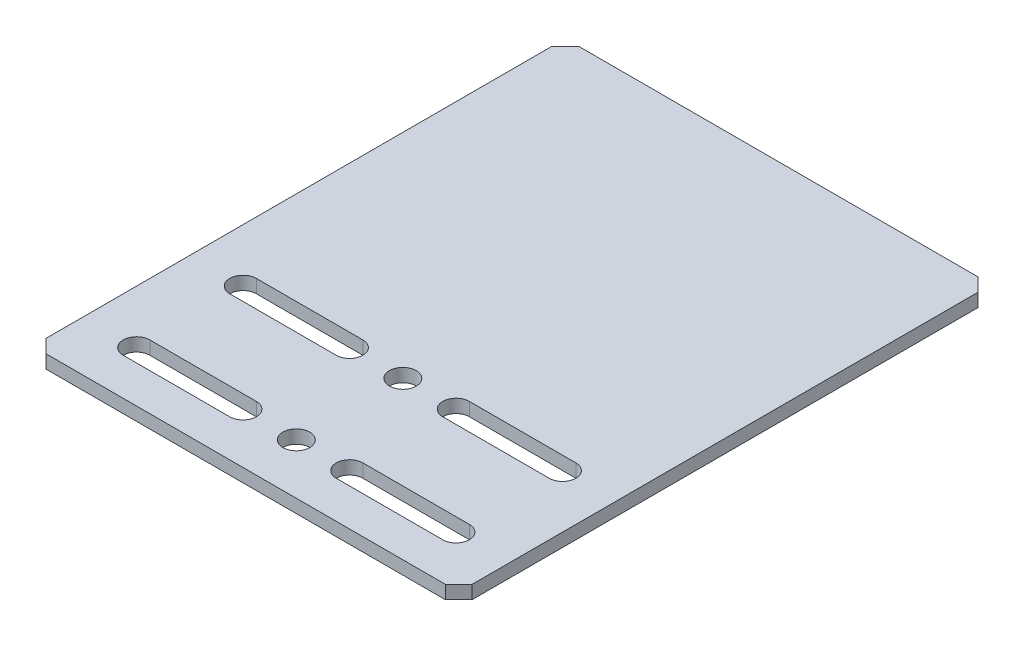
ISO-10303-21;
HEADER;
FILE_DESCRIPTION(('STEP AP214'),'2;1');
FILE_NAME('part.step','',(''),(''),'','','');
FILE_SCHEMA(('AUTOMOTIVE_DESIGN { 1 0 10303 214 1 1 1 1 }'));
ENDSEC;
DATA;
#1=APPLICATION_CONTEXT('core data for automotive mechanical design processes');
#2=APPLICATION_PROTOCOL_DEFINITION('international standard','automotive_design',2000,#1);
#3=PRODUCT_CONTEXT('',#1,'mechanical');
#4=PRODUCT('Part','Part','',(#3));
#5=PRODUCT_RELATED_PRODUCT_CATEGORY('part','',(#4));
#6=PRODUCT_DEFINITION_FORMATION('','',#4);
#7=PRODUCT_DEFINITION_CONTEXT('part definition',#1,'design');
#8=PRODUCT_DEFINITION('design','',#6,#7);
#9=PRODUCT_DEFINITION_SHAPE('','',#8);
#10=(LENGTH_UNIT() NAMED_UNIT(*) SI_UNIT(.MILLI.,.METRE.));
#11=(NAMED_UNIT(*) PLANE_ANGLE_UNIT() SI_UNIT($,.RADIAN.));
#12=(NAMED_UNIT(*) SI_UNIT($,.STERADIAN.) SOLID_ANGLE_UNIT());
#13=UNCERTAINTY_MEASURE_WITH_UNIT(LENGTH_MEASURE(1.E-05),#10,'distance_accuracy_value','');
#14=(GEOMETRIC_REPRESENTATION_CONTEXT(3) GLOBAL_UNCERTAINTY_ASSIGNED_CONTEXT((#13)) GLOBAL_UNIT_ASSIGNED_CONTEXT((#10,
#11,#12)) REPRESENTATION_CONTEXT('',''));
#15=CARTESIAN_POINT('',(0.,0.,0.));
#16=DIRECTION('',(0.,0.,1.));
#17=DIRECTION('',(1.,0.,0.));
#18=AXIS2_PLACEMENT_3D('',#15,#16,#17);
#19=CARTESIAN_POINT('',(0.,3.175,0.));
#20=DIRECTION('',(0.,1.,0.));
#21=DIRECTION('',(0.,0.,1.));
#22=AXIS2_PLACEMENT_3D('',#19,#20,#21);
#23=PLANE('',#22);
#24=DIRECTION('',(-1.,0.,0.));
#25=VECTOR('',#24,1.);
#26=CARTESIAN_POINT('',(0.,3.175,0.));
#27=LINE('',#26,#25);
#28=CARTESIAN_POINT('',(3.175,3.175,0.));
#29=VERTEX_POINT('',#28);
#30=CARTESIAN_POINT('',(98.425,3.175,0.));
#31=VERTEX_POINT('',#30);
#32=EDGE_CURVE('E326',#29,#31,#27,.F.);
#33=ORIENTED_EDGE('',*,*,#32,.T.);
#34=DIRECTION('',(-0.707106781186548,0.,0.707106781186548));
#35=VECTOR('',#34,1.);
#36=CARTESIAN_POINT('',(101.6,3.175,-3.17500000000001));
#37=LINE('',#36,#35);
#38=CARTESIAN_POINT('',(101.6,3.175,-3.17500000000004));
#39=VERTEX_POINT('',#38);
#40=EDGE_CURVE('E321',#31,#39,#37,.F.);
#41=ORIENTED_EDGE('',*,*,#40,.T.);
#42=DIRECTION('',(0.,0.,1.));
#43=VECTOR('',#42,1.);
#44=CARTESIAN_POINT('',(101.6,3.175,-127.));
#45=LINE('',#44,#43);
#46=CARTESIAN_POINT('',(101.6,3.175,-123.825));
#47=VERTEX_POINT('',#46);
#48=EDGE_CURVE('E316',#39,#47,#45,.F.);
#49=ORIENTED_EDGE('',*,*,#48,.T.);
#50=DIRECTION('',(0.707106781186544,0.,0.707106781186551));
#51=VECTOR('',#50,1.);
#52=CARTESIAN_POINT('',(98.425,3.175,-127.));
#53=LINE('',#52,#51);
#54=CARTESIAN_POINT('',(98.425,3.175,-127.));
#55=VERTEX_POINT('',#54);
#56=EDGE_CURVE('E311',#47,#55,#53,.F.);
#57=ORIENTED_EDGE('',*,*,#56,.T.);
#58=DIRECTION('',(1.,0.,0.));
#59=VECTOR('',#58,1.);
#60=CARTESIAN_POINT('',(0.,3.175,-127.));
#61=LINE('',#60,#59);
#62=CARTESIAN_POINT('',(3.17499999999998,3.175,-127.));
#63=VERTEX_POINT('',#62);
#64=EDGE_CURVE('E265',#55,#63,#61,.F.);
#65=ORIENTED_EDGE('',*,*,#64,.T.);
#66=DIRECTION('',(0.707106781186548,0.,-0.707106781186548));
#67=VECTOR('',#66,1.);
#68=CARTESIAN_POINT('',(0.,3.175,-123.825));
#69=LINE('',#68,#67);
#70=CARTESIAN_POINT('',(0.,3.175,-123.825));
#71=VERTEX_POINT('',#70);
#72=EDGE_CURVE('E341',#63,#71,#69,.F.);
#73=ORIENTED_EDGE('',*,*,#72,.T.);
#74=DIRECTION('',(0.,0.,-1.));
#75=VECTOR('',#74,1.);
#76=CARTESIAN_POINT('',(0.,3.175,-127.));
#77=LINE('',#76,#75);
#78=CARTESIAN_POINT('',(0.,3.175,-3.17500000000005));
#79=VERTEX_POINT('',#78);
#80=EDGE_CURVE('E336',#71,#79,#77,.F.);
#81=ORIENTED_EDGE('',*,*,#80,.T.);
#82=DIRECTION('',(-0.707106781186546,0.,-0.707106781186549));
#83=VECTOR('',#82,1.);
#84=CARTESIAN_POINT('',(3.175,3.175,0.));
#85=LINE('',#84,#83);
#86=EDGE_CURVE('E331',#79,#29,#85,.F.);
#87=ORIENTED_EDGE('',*,*,#86,.T.);
#88=EDGE_LOOP('',(#33,#41,#49,#57,#65,#73,#81,#87));
#89=FACE_BOUND('',#88,.T.);
#90=CARTESIAN_POINT('',(88.9,3.175,-12.065));
#91=DIRECTION('',(0.,-1.,0.));
#92=DIRECTION('',(0.,0.,-1.));
#93=AXIS2_PLACEMENT_3D('',#90,#91,#92);
#94=CIRCLE('',#93,3.175);
#95=CARTESIAN_POINT('',(88.9,3.175,-15.24));
#96=VERTEX_POINT('',#95);
#97=CARTESIAN_POINT('',(88.9,3.175,-8.89000000000003));
#98=VERTEX_POINT('',#97);
#99=EDGE_CURVE('E266',#96,#98,#94,.T.);
#100=ORIENTED_EDGE('',*,*,#99,.T.);
#101=DIRECTION('',(1.,0.,0.));
#102=VECTOR('',#101,1.);
#103=CARTESIAN_POINT('',(60.325,3.175,-8.89000000000001));
#104=LINE('',#103,#102);
#105=CARTESIAN_POINT('',(63.5,3.175,-8.89000000000002));
#106=VERTEX_POINT('',#105);
#107=EDGE_CURVE('E203',#98,#106,#104,.F.);
#108=ORIENTED_EDGE('',*,*,#107,.T.);
#109=CARTESIAN_POINT('',(63.5,3.175,-12.065));
#110=DIRECTION('',(0.,-1.,0.));
#111=DIRECTION('',(0.,0.,-1.));
#112=AXIS2_PLACEMENT_3D('',#109,#110,#111);
#113=CIRCLE('',#112,3.175);
#114=CARTESIAN_POINT('',(63.5,3.175,-15.24));
#115=VERTEX_POINT('',#114);
#116=EDGE_CURVE('E270',#106,#115,#113,.T.);
#117=ORIENTED_EDGE('',*,*,#116,.T.);
#118=DIRECTION('',(-1.,0.,0.));
#119=VECTOR('',#118,1.);
#120=CARTESIAN_POINT('',(60.325,3.175,-15.24));
#121=LINE('',#120,#119);
#122=EDGE_CURVE('E208',#115,#96,#121,.F.);
#123=ORIENTED_EDGE('',*,*,#122,.T.);
#124=EDGE_LOOP('',(#100,#108,#117,#123));
#125=FACE_BOUND('',#124,.T.);
#126=CARTESIAN_POINT('',(38.1,3.175,-12.065));
#127=DIRECTION('',(0.,-1.,0.));
#128=DIRECTION('',(0.,0.,-1.));
#129=AXIS2_PLACEMENT_3D('',#126,#127,#128);
#130=CIRCLE('',#129,3.175);
#131=CARTESIAN_POINT('',(38.1,3.175,-15.24));
#132=VERTEX_POINT('',#131);
#133=CARTESIAN_POINT('',(38.1,3.175,-8.89000000000001));
#134=VERTEX_POINT('',#133);
#135=EDGE_CURVE('E272',#132,#134,#130,.T.);
#136=ORIENTED_EDGE('',*,*,#135,.T.);
#137=DIRECTION('',(1.,0.,0.));
#138=VECTOR('',#137,1.);
#139=CARTESIAN_POINT('',(9.52499999999997,3.175,-8.89));
#140=LINE('',#139,#138);
#141=CARTESIAN_POINT('',(12.7,3.175,-8.89));
#142=VERTEX_POINT('',#141);
#143=EDGE_CURVE('E213',#134,#142,#140,.F.);
#144=ORIENTED_EDGE('',*,*,#143,.T.);
#145=CARTESIAN_POINT('',(12.7,3.175,-12.065));
#146=DIRECTION('',(0.,-1.,0.));
#147=DIRECTION('',(0.,0.,-1.));
#148=AXIS2_PLACEMENT_3D('',#145,#146,#147);
#149=CIRCLE('',#148,3.175);
#150=CARTESIAN_POINT('',(12.7,3.175,-15.24));
#151=VERTEX_POINT('',#150);
#152=EDGE_CURVE('E275',#142,#151,#149,.T.);
#153=ORIENTED_EDGE('',*,*,#152,.T.);
#154=DIRECTION('',(-1.,0.,0.));
#155=VECTOR('',#154,1.);
#156=CARTESIAN_POINT('',(9.52499999999996,3.175,-15.24));
#157=LINE('',#156,#155);
#158=EDGE_CURVE('E218',#151,#132,#157,.F.);
#159=ORIENTED_EDGE('',*,*,#158,.T.);
#160=EDGE_LOOP('',(#136,#144,#153,#159));
#161=FACE_BOUND('',#160,.T.);
#162=CARTESIAN_POINT('',(50.8,3.175,-12.065));
#163=DIRECTION('',(0.,1.,0.));
#164=DIRECTION('',(0.,0.,1.));
#165=AXIS2_PLACEMENT_3D('',#162,#163,#164);
#166=CIRCLE('',#165,3.2004);
#167=CARTESIAN_POINT('',(50.8,3.175,-8.86460000000001));
#168=VERTEX_POINT('',#167);
#169=EDGE_CURVE('E217',#168,#168,#166,.F.);
#170=ORIENTED_EDGE('',*,*,#169,.T.);
#171=EDGE_LOOP('',(#170));
#172=FACE_BOUND('',#171,.T.);
#173=DIRECTION('',(-1.,0.,0.));
#174=VECTOR('',#173,1.);
#175=CARTESIAN_POINT('',(9.52499999999996,3.175,-40.64));
#176=LINE('',#175,#174);
#177=CARTESIAN_POINT('',(12.7,3.175,-40.64));
#178=VERTEX_POINT('',#177);
#179=CARTESIAN_POINT('',(38.1,3.175,-40.64));
#180=VERTEX_POINT('',#179);
#181=EDGE_CURVE('E227',#178,#180,#176,.F.);
#182=ORIENTED_EDGE('',*,*,#181,.T.);
#183=CARTESIAN_POINT('',(38.1,3.175,-37.465));
#184=DIRECTION('',(0.,-1.,0.));
#185=DIRECTION('',(0.,0.,-1.));
#186=AXIS2_PLACEMENT_3D('',#183,#184,#185);
#187=CIRCLE('',#186,3.175);
#188=CARTESIAN_POINT('',(38.1,3.175,-34.29));
#189=VERTEX_POINT('',#188);
#190=EDGE_CURVE('E281',#180,#189,#187,.T.);
#191=ORIENTED_EDGE('',*,*,#190,.T.);
#192=DIRECTION('',(1.,0.,0.));
#193=VECTOR('',#192,1.);
#194=CARTESIAN_POINT('',(9.52499999999996,3.175,-34.29));
#195=LINE('',#194,#193);
#196=CARTESIAN_POINT('',(12.7,3.175,-34.29));
#197=VERTEX_POINT('',#196);
#198=EDGE_CURVE('E223',#189,#197,#195,.F.);
#199=ORIENTED_EDGE('',*,*,#198,.T.);
#200=CARTESIAN_POINT('',(12.7,3.175,-37.465));
#201=DIRECTION('',(0.,-1.,0.));
#202=DIRECTION('',(0.,0.,-1.));
#203=AXIS2_PLACEMENT_3D('',#200,#201,#202);
#204=CIRCLE('',#203,3.175);
#205=EDGE_CURVE('E279',#197,#178,#204,.T.);
#206=ORIENTED_EDGE('',*,*,#205,.T.);
#207=EDGE_LOOP('',(#182,#191,#199,#206));
#208=FACE_BOUND('',#207,.T.);
#209=CARTESIAN_POINT('',(50.8,3.175,-37.465));
#210=DIRECTION('',(0.,1.,0.));
#211=DIRECTION('',(0.,0.,1.));
#212=AXIS2_PLACEMENT_3D('',#209,#210,#211);
#213=CIRCLE('',#212,3.2004);
#214=CARTESIAN_POINT('',(50.8,3.175,-34.2646));
#215=VERTEX_POINT('',#214);
#216=EDGE_CURVE('E187',#215,#215,#213,.F.);
#217=ORIENTED_EDGE('',*,*,#216,.T.);
#218=EDGE_LOOP('',(#217));
#219=FACE_BOUND('',#218,.T.);
#220=DIRECTION('',(-1.,0.,0.));
#221=VECTOR('',#220,1.);
#222=CARTESIAN_POINT('',(60.325,3.175,-40.64));
#223=LINE('',#222,#221);
#224=CARTESIAN_POINT('',(63.5,3.175,-40.64));
#225=VERTEX_POINT('',#224);
#226=CARTESIAN_POINT('',(88.9,3.175,-40.64));
#227=VERTEX_POINT('',#226);
#228=EDGE_CURVE('E179',#225,#227,#223,.F.);
#229=ORIENTED_EDGE('',*,*,#228,.T.);
#230=CARTESIAN_POINT('',(88.9,3.175,-37.465));
#231=DIRECTION('',(0.,-1.,0.));
#232=DIRECTION('',(0.,0.,-1.));
#233=AXIS2_PLACEMENT_3D('',#230,#231,#232);
#234=CIRCLE('',#233,3.175);
#235=CARTESIAN_POINT('',(88.9,3.175,-34.29));
#236=VERTEX_POINT('',#235);
#237=EDGE_CURVE('E19',#227,#236,#234,.T.);
#238=ORIENTED_EDGE('',*,*,#237,.T.);
#239=DIRECTION('',(1.,0.,0.));
#240=VECTOR('',#239,1.);
#241=CARTESIAN_POINT('',(60.325,3.175,-34.29));
#242=LINE('',#241,#240);
#243=CARTESIAN_POINT('',(63.5,3.175,-34.29));
#244=VERTEX_POINT('',#243);
#245=EDGE_CURVE('E182',#236,#244,#242,.F.);
#246=ORIENTED_EDGE('',*,*,#245,.T.);
#247=CARTESIAN_POINT('',(63.5,3.175,-37.465));
#248=DIRECTION('',(0.,-1.,0.));
#249=DIRECTION('',(0.,0.,-1.));
#250=AXIS2_PLACEMENT_3D('',#247,#248,#249);
#251=CIRCLE('',#250,3.175);
#252=EDGE_CURVE('E177',#244,#225,#251,.T.);
#253=ORIENTED_EDGE('',*,*,#252,.T.);
#254=EDGE_LOOP('',(#229,#238,#246,#253));
#255=FACE_BOUND('',#254,.T.);
#256=ADVANCED_FACE('F16',(#89,#125,#161,#172,#208,#219,#255),#23,.T.);
#257=CARTESIAN_POINT('',(60.325,0.,-40.64));
#258=DIRECTION('',(0.,0.,-1.));
#259=DIRECTION('',(-1.,0.,0.));
#260=AXIS2_PLACEMENT_3D('',#257,#258,#259);
#261=PLANE('',#260);
#262=DIRECTION('',(0.,1.,0.));
#263=VECTOR('',#262,1.);
#264=CARTESIAN_POINT('',(63.5,0.,-40.64));
#265=LINE('',#264,#263);
#266=CARTESIAN_POINT('',(63.5,0.,-40.64));
#267=VERTEX_POINT('',#266);
#268=EDGE_CURVE('E192',#267,#225,#265,.T.);
#269=ORIENTED_EDGE('',*,*,#268,.F.);
#270=DIRECTION('',(1.,0.,0.));
#271=VECTOR('',#270,1.);
#272=CARTESIAN_POINT('',(0.,0.,-40.64));
#273=LINE('',#272,#271);
#274=CARTESIAN_POINT('',(88.9,0.,-40.64));
#275=VERTEX_POINT('',#274);
#276=EDGE_CURVE('E263',#267,#275,#273,.T.);
#277=ORIENTED_EDGE('',*,*,#276,.T.);
#278=DIRECTION('',(0.,-1.,0.));
#279=VECTOR('',#278,1.);
#280=CARTESIAN_POINT('',(88.9,0.,-40.64));
#281=LINE('',#280,#279);
#282=EDGE_CURVE('E194',#275,#227,#281,.F.);
#283=ORIENTED_EDGE('',*,*,#282,.T.);
#284=ORIENTED_EDGE('',*,*,#228,.F.);
#285=EDGE_LOOP('',(#269,#277,#283,#284));
#286=FACE_BOUND('',#285,.T.);
#287=ADVANCED_FACE('F190',(#286),#261,.F.);
#288=CARTESIAN_POINT('',(88.9,0.,-37.465));
#289=DIRECTION('',(0.,-1.,0.));
#290=DIRECTION('',(0.,0.,-1.));
#291=AXIS2_PLACEMENT_3D('',#288,#289,#290);
#292=CYLINDRICAL_SURFACE('',#291,3.175);
#293=DIRECTION('',(0.,1.,0.));
#294=VECTOR('',#293,1.);
#295=CARTESIAN_POINT('',(88.9,0.,-34.29));
#296=LINE('',#295,#294);
#297=CARTESIAN_POINT('',(88.9,0.,-34.29));
#298=VERTEX_POINT('',#297);
#299=EDGE_CURVE('E232',#298,#236,#296,.T.);
#300=ORIENTED_EDGE('',*,*,#299,.T.);
#301=ORIENTED_EDGE('',*,*,#237,.F.);
#302=ORIENTED_EDGE('',*,*,#282,.F.);
#303=CARTESIAN_POINT('',(88.9,0.,-37.465));
#304=DIRECTION('',(0.,-1.,0.));
#305=DIRECTION('',(0.,0.,-1.));
#306=AXIS2_PLACEMENT_3D('',#303,#304,#305);
#307=CIRCLE('',#306,3.175);
#308=EDGE_CURVE('E261',#275,#298,#307,.T.);
#309=ORIENTED_EDGE('',*,*,#308,.T.);
#310=EDGE_LOOP('',(#300,#301,#302,#309));
#311=FACE_BOUND('',#310,.T.);
#312=ADVANCED_FACE('F510',(#311),#292,.F.);
#313=CARTESIAN_POINT('',(60.325,0.,-34.29));
#314=DIRECTION('',(0.,0.,1.));
#315=DIRECTION('',(1.,0.,0.));
#316=AXIS2_PLACEMENT_3D('',#313,#314,#315);
#317=PLANE('',#316);
#318=DIRECTION('',(0.,-1.,0.));
#319=VECTOR('',#318,1.);
#320=CARTESIAN_POINT('',(63.5,0.,-34.29));
#321=LINE('',#320,#319);
#322=CARTESIAN_POINT('',(63.5,0.,-34.29));
#323=VERTEX_POINT('',#322);
#324=EDGE_CURVE('E188',#323,#244,#321,.F.);
#325=ORIENTED_EDGE('',*,*,#324,.T.);
#326=ORIENTED_EDGE('',*,*,#245,.F.);
#327=ORIENTED_EDGE('',*,*,#299,.F.);
#328=DIRECTION('',(1.,0.,0.));
#329=VECTOR('',#328,1.);
#330=CARTESIAN_POINT('',(0.,0.,-34.29));
#331=LINE('',#330,#329);
#332=EDGE_CURVE('E260',#298,#323,#331,.F.);
#333=ORIENTED_EDGE('',*,*,#332,.T.);
#334=EDGE_LOOP('',(#325,#326,#327,#333));
#335=FACE_BOUND('',#334,.T.);
#336=ADVANCED_FACE('F295',(#335),#317,.F.);
#337=CARTESIAN_POINT('',(63.5,0.,-37.465));
#338=DIRECTION('',(0.,-1.,0.));
#339=DIRECTION('',(0.,0.,-1.));
#340=AXIS2_PLACEMENT_3D('',#337,#338,#339);
#341=CYLINDRICAL_SURFACE('',#340,3.175);
#342=ORIENTED_EDGE('',*,*,#324,.F.);
#343=CARTESIAN_POINT('',(63.5,0.,-37.465));
#344=DIRECTION('',(0.,-1.,0.));
#345=DIRECTION('',(0.,0.,-1.));
#346=AXIS2_PLACEMENT_3D('',#343,#344,#345);
#347=CIRCLE('',#346,3.175);
#348=EDGE_CURVE('E198',#323,#267,#347,.T.);
#349=ORIENTED_EDGE('',*,*,#348,.T.);
#350=ORIENTED_EDGE('',*,*,#268,.T.);
#351=ORIENTED_EDGE('',*,*,#252,.F.);
#352=EDGE_LOOP('',(#342,#349,#350,#351));
#353=FACE_BOUND('',#352,.T.);
#354=ADVANCED_FACE('F197',(#353),#341,.F.);
#355=CARTESIAN_POINT('',(50.8,0.,-37.465));
#356=DIRECTION('',(0.,1.,0.));
#357=DIRECTION('',(0.,0.,1.));
#358=AXIS2_PLACEMENT_3D('',#355,#356,#357);
#359=CYLINDRICAL_SURFACE('',#358,3.2004);
#360=CARTESIAN_POINT('',(50.8,0.,-37.465));
#361=DIRECTION('',(0.,1.,0.));
#362=DIRECTION('',(0.,0.,1.));
#363=AXIS2_PLACEMENT_3D('',#360,#361,#362);
#364=CIRCLE('',#363,3.2004);
#365=CARTESIAN_POINT('',(50.8,0.,-34.2646));
#366=VERTEX_POINT('',#365);
#367=EDGE_CURVE('E257',#366,#366,#364,.F.);
#368=ORIENTED_EDGE('',*,*,#367,.T.);
#369=EDGE_LOOP('',(#368));
#370=FACE_BOUND('',#369,.T.);
#371=ORIENTED_EDGE('',*,*,#216,.F.);
#372=EDGE_LOOP('',(#371));
#373=FACE_BOUND('',#372,.T.);
#374=ADVANCED_FACE('F501',(#370,#373),#359,.F.);
#375=CARTESIAN_POINT('',(9.52499999999996,0.,-40.64));
#376=DIRECTION('',(0.,0.,-1.));
#377=DIRECTION('',(-1.,0.,0.));
#378=AXIS2_PLACEMENT_3D('',#375,#376,#377);
#379=PLANE('',#378);
#380=DIRECTION('',(0.,-1.,0.));
#381=VECTOR('',#380,1.);
#382=CARTESIAN_POINT('',(38.1,0.,-40.64));
#383=LINE('',#382,#381);
#384=CARTESIAN_POINT('',(38.1,0.,-40.64));
#385=VERTEX_POINT('',#384);
#386=EDGE_CURVE('E230',#385,#180,#383,.F.);
#387=ORIENTED_EDGE('',*,*,#386,.T.);
#388=ORIENTED_EDGE('',*,*,#181,.F.);
#389=DIRECTION('',(0.,1.,0.));
#390=VECTOR('',#389,1.);
#391=CARTESIAN_POINT('',(12.7,0.,-40.64));
#392=LINE('',#391,#390);
#393=CARTESIAN_POINT('',(12.7,0.,-40.64));
#394=VERTEX_POINT('',#393);
#395=EDGE_CURVE('E231',#394,#178,#392,.T.);
#396=ORIENTED_EDGE('',*,*,#395,.F.);
#397=DIRECTION('',(1.,0.,0.));
#398=VECTOR('',#397,1.);
#399=CARTESIAN_POINT('',(0.,0.,-40.64));
#400=LINE('',#399,#398);
#401=EDGE_CURVE('E253',#394,#385,#400,.T.);
#402=ORIENTED_EDGE('',*,*,#401,.T.);
#403=EDGE_LOOP('',(#387,#388,#396,#402));
#404=FACE_BOUND('',#403,.T.);
#405=ADVANCED_FACE('F498',(#404),#379,.F.);
#406=CARTESIAN_POINT('',(38.1,0.,-37.465));
#407=DIRECTION('',(0.,-1.,0.));
#408=DIRECTION('',(0.,0.,-1.));
#409=AXIS2_PLACEMENT_3D('',#406,#407,#408);
#410=CYLINDRICAL_SURFACE('',#409,3.175);
#411=DIRECTION('',(0.,1.,0.));
#412=VECTOR('',#411,1.);
#413=CARTESIAN_POINT('',(38.1,0.,-34.29));
#414=LINE('',#413,#412);
#415=CARTESIAN_POINT('',(38.1,0.,-34.29));
#416=VERTEX_POINT('',#415);
#417=EDGE_CURVE('E226',#416,#189,#414,.T.);
#418=ORIENTED_EDGE('',*,*,#417,.T.);
#419=ORIENTED_EDGE('',*,*,#190,.F.);
#420=ORIENTED_EDGE('',*,*,#386,.F.);
#421=CARTESIAN_POINT('',(38.1,0.,-37.465));
#422=DIRECTION('',(0.,-1.,0.));
#423=DIRECTION('',(0.,0.,-1.));
#424=AXIS2_PLACEMENT_3D('',#421,#422,#423);
#425=CIRCLE('',#424,3.175);
#426=EDGE_CURVE('E251',#385,#416,#425,.T.);
#427=ORIENTED_EDGE('',*,*,#426,.T.);
#428=EDGE_LOOP('',(#418,#419,#420,#427));
#429=FACE_BOUND('',#428,.T.);
#430=ADVANCED_FACE('F363',(#429),#410,.F.);
#431=CARTESIAN_POINT('',(9.52499999999996,0.,-34.29));
#432=DIRECTION('',(0.,0.,1.));
#433=DIRECTION('',(1.,0.,0.));
#434=AXIS2_PLACEMENT_3D('',#431,#432,#433);
#435=PLANE('',#434);
#436=ORIENTED_EDGE('',*,*,#417,.F.);
#437=DIRECTION('',(1.,0.,0.));
#438=VECTOR('',#437,1.);
#439=CARTESIAN_POINT('',(0.,0.,-34.29));
#440=LINE('',#439,#438);
#441=CARTESIAN_POINT('',(12.7,0.,-34.29));
#442=VERTEX_POINT('',#441);
#443=EDGE_CURVE('E250',#416,#442,#440,.F.);
#444=ORIENTED_EDGE('',*,*,#443,.T.);
#445=DIRECTION('',(0.,-1.,0.));
#446=VECTOR('',#445,1.);
#447=CARTESIAN_POINT('',(12.7,0.,-34.29));
#448=LINE('',#447,#446);
#449=EDGE_CURVE('E225',#442,#197,#448,.F.);
#450=ORIENTED_EDGE('',*,*,#449,.T.);
#451=ORIENTED_EDGE('',*,*,#198,.F.);
#452=EDGE_LOOP('',(#436,#444,#450,#451));
#453=FACE_BOUND('',#452,.T.);
#454=ADVANCED_FACE('F369',(#453),#435,.F.);
#455=CARTESIAN_POINT('',(12.7,0.,-37.465));
#456=DIRECTION('',(0.,-1.,0.));
#457=DIRECTION('',(0.,0.,-1.));
#458=AXIS2_PLACEMENT_3D('',#455,#456,#457);
#459=CYLINDRICAL_SURFACE('',#458,3.175);
#460=ORIENTED_EDGE('',*,*,#449,.F.);
#461=CARTESIAN_POINT('',(12.7,0.,-37.465));
#462=DIRECTION('',(0.,-1.,0.));
#463=DIRECTION('',(0.,0.,-1.));
#464=AXIS2_PLACEMENT_3D('',#461,#462,#463);
#465=CIRCLE('',#464,3.175);
#466=EDGE_CURVE('E254',#442,#394,#465,.T.);
#467=ORIENTED_EDGE('',*,*,#466,.T.);
#468=ORIENTED_EDGE('',*,*,#395,.T.);
#469=ORIENTED_EDGE('',*,*,#205,.F.);
#470=EDGE_LOOP('',(#460,#467,#468,#469));
#471=FACE_BOUND('',#470,.T.);
#472=ADVANCED_FACE('F490',(#471),#459,.F.);
#473=CARTESIAN_POINT('',(50.8,0.,-12.065));
#474=DIRECTION('',(0.,1.,0.));
#475=DIRECTION('',(0.,0.,1.));
#476=AXIS2_PLACEMENT_3D('',#473,#474,#475);
#477=CYLINDRICAL_SURFACE('',#476,3.2004);
#478=CARTESIAN_POINT('',(50.8,0.,-12.065));
#479=DIRECTION('',(0.,1.,0.));
#480=DIRECTION('',(0.,0.,1.));
#481=AXIS2_PLACEMENT_3D('',#478,#479,#480);
#482=CIRCLE('',#481,3.2004);
#483=CARTESIAN_POINT('',(50.8,0.,-8.86460000000001));
#484=VERTEX_POINT('',#483);
#485=EDGE_CURVE('E247',#484,#484,#482,.F.);
#486=ORIENTED_EDGE('',*,*,#485,.T.);
#487=EDGE_LOOP('',(#486));
#488=FACE_BOUND('',#487,.T.);
#489=ORIENTED_EDGE('',*,*,#169,.F.);
#490=EDGE_LOOP('',(#489));
#491=FACE_BOUND('',#490,.T.);
#492=ADVANCED_FACE('F486',(#488,#491),#477,.F.);
#493=CARTESIAN_POINT('',(9.52499999999997,0.,-8.89));
#494=DIRECTION('',(0.,0.,1.));
#495=DIRECTION('',(1.,0.,0.));
#496=AXIS2_PLACEMENT_3D('',#493,#494,#495);
#497=PLANE('',#496);
#498=DIRECTION('',(0.,-1.,0.));
#499=VECTOR('',#498,1.);
#500=CARTESIAN_POINT('',(38.1,0.,-8.89000000000001));
#501=LINE('',#500,#499);
#502=CARTESIAN_POINT('',(38.1,0.,-8.89000000000001));
#503=VERTEX_POINT('',#502);
#504=EDGE_CURVE('E207',#134,#503,#501,.T.);
#505=ORIENTED_EDGE('',*,*,#504,.T.);
#506=DIRECTION('',(1.,0.,0.));
#507=VECTOR('',#506,1.);
#508=CARTESIAN_POINT('',(0.,0.,-8.89));
#509=LINE('',#508,#507);
#510=CARTESIAN_POINT('',(12.7,0.,-8.89));
#511=VERTEX_POINT('',#510);
#512=EDGE_CURVE('E246',#503,#511,#509,.F.);
#513=ORIENTED_EDGE('',*,*,#512,.T.);
#514=DIRECTION('',(0.,-1.,0.));
#515=VECTOR('',#514,1.);
#516=CARTESIAN_POINT('',(12.7,0.,-8.89));
#517=LINE('',#516,#515);
#518=EDGE_CURVE('E216',#511,#142,#517,.F.);
#519=ORIENTED_EDGE('',*,*,#518,.T.);
#520=ORIENTED_EDGE('',*,*,#143,.F.);
#521=EDGE_LOOP('',(#505,#513,#519,#520));
#522=FACE_BOUND('',#521,.T.);
#523=ADVANCED_FACE('F482',(#522),#497,.F.);
#524=CARTESIAN_POINT('',(12.7,0.,-12.065));
#525=DIRECTION('',(0.,-1.,0.));
#526=DIRECTION('',(0.,0.,-1.));
#527=AXIS2_PLACEMENT_3D('',#524,#525,#526);
#528=CYLINDRICAL_SURFACE('',#527,3.175);
#529=CARTESIAN_POINT('',(12.7,0.,-12.065));
#530=DIRECTION('',(0.,-1.,0.));
#531=DIRECTION('',(0.,0.,-1.));
#532=AXIS2_PLACEMENT_3D('',#529,#530,#531);
#533=CIRCLE('',#532,3.175);
#534=CARTESIAN_POINT('',(12.7,0.,-15.24));
#535=VERTEX_POINT('',#534);
#536=EDGE_CURVE('E244',#511,#535,#533,.T.);
#537=ORIENTED_EDGE('',*,*,#536,.T.);
#538=DIRECTION('',(0.,1.,0.));
#539=VECTOR('',#538,1.);
#540=CARTESIAN_POINT('',(12.7,0.,-15.24));
#541=LINE('',#540,#539);
#542=EDGE_CURVE('E222',#535,#151,#541,.T.);
#543=ORIENTED_EDGE('',*,*,#542,.T.);
#544=ORIENTED_EDGE('',*,*,#152,.F.);
#545=ORIENTED_EDGE('',*,*,#518,.F.);
#546=EDGE_LOOP('',(#537,#543,#544,#545));
#547=FACE_BOUND('',#546,.T.);
#548=ADVANCED_FACE('F478',(#547),#528,.F.);
#549=CARTESIAN_POINT('',(9.52499999999996,0.,-15.24));
#550=DIRECTION('',(0.,0.,-1.));
#551=DIRECTION('',(-1.,0.,0.));
#552=AXIS2_PLACEMENT_3D('',#549,#550,#551);
#553=PLANE('',#552);
#554=DIRECTION('',(0.,-1.,0.));
#555=VECTOR('',#554,1.);
#556=CARTESIAN_POINT('',(38.1,0.,-15.24));
#557=LINE('',#556,#555);
#558=CARTESIAN_POINT('',(38.1,0.,-15.24));
#559=VERTEX_POINT('',#558);
#560=EDGE_CURVE('E221',#559,#132,#557,.F.);
#561=ORIENTED_EDGE('',*,*,#560,.T.);
#562=ORIENTED_EDGE('',*,*,#158,.F.);
#563=ORIENTED_EDGE('',*,*,#542,.F.);
#564=DIRECTION('',(1.,0.,0.));
#565=VECTOR('',#564,1.);
#566=CARTESIAN_POINT('',(0.,0.,-15.24));
#567=LINE('',#566,#565);
#568=EDGE_CURVE('E243',#535,#559,#567,.T.);
#569=ORIENTED_EDGE('',*,*,#568,.T.);
#570=EDGE_LOOP('',(#561,#562,#563,#569));
#571=FACE_BOUND('',#570,.T.);
#572=ADVANCED_FACE('F474',(#571),#553,.F.);
#573=CARTESIAN_POINT('',(38.1,0.,-12.065));
#574=DIRECTION('',(0.,-1.,0.));
#575=DIRECTION('',(0.,0.,-1.));
#576=AXIS2_PLACEMENT_3D('',#573,#574,#575);
#577=CYLINDRICAL_SURFACE('',#576,3.175);
#578=ORIENTED_EDGE('',*,*,#504,.F.);
#579=ORIENTED_EDGE('',*,*,#135,.F.);
#580=ORIENTED_EDGE('',*,*,#560,.F.);
#581=CARTESIAN_POINT('',(38.1,0.,-12.065));
#582=DIRECTION('',(0.,-1.,0.));
#583=DIRECTION('',(0.,0.,-1.));
#584=AXIS2_PLACEMENT_3D('',#581,#582,#583);
#585=CIRCLE('',#584,3.175);
#586=EDGE_CURVE('E241',#559,#503,#585,.T.);
#587=ORIENTED_EDGE('',*,*,#586,.T.);
#588=EDGE_LOOP('',(#578,#579,#580,#587));
#589=FACE_BOUND('',#588,.T.);
#590=ADVANCED_FACE('F470',(#589),#577,.F.);
#591=CARTESIAN_POINT('',(60.325,0.,-8.89000000000001));
#592=DIRECTION('',(0.,0.,1.));
#593=DIRECTION('',(1.,0.,0.));
#594=AXIS2_PLACEMENT_3D('',#591,#592,#593);
#595=PLANE('',#594);
#596=DIRECTION('',(0.,-1.,0.));
#597=VECTOR('',#596,1.);
#598=CARTESIAN_POINT('',(63.5,0.,-8.89000000000002));
#599=LINE('',#598,#597);
#600=CARTESIAN_POINT('',(63.5,0.,-8.89000000000002));
#601=VERTEX_POINT('',#600);
#602=EDGE_CURVE('E206',#601,#106,#599,.F.);
#603=ORIENTED_EDGE('',*,*,#602,.T.);
#604=ORIENTED_EDGE('',*,*,#107,.F.);
#605=DIRECTION('',(0.,-1.,0.));
#606=VECTOR('',#605,1.);
#607=CARTESIAN_POINT('',(88.9,0.,-8.89000000000003));
#608=LINE('',#607,#606);
#609=CARTESIAN_POINT('',(88.9,0.,-8.89000000000003));
#610=VERTEX_POINT('',#609);
#611=EDGE_CURVE('E269',#98,#610,#608,.T.);
#612=ORIENTED_EDGE('',*,*,#611,.T.);
#613=DIRECTION('',(1.,0.,0.));
#614=VECTOR('',#613,1.);
#615=CARTESIAN_POINT('',(0.,0.,-8.89000000000003));
#616=LINE('',#615,#614);
#617=EDGE_CURVE('E240',#610,#601,#616,.F.);
#618=ORIENTED_EDGE('',*,*,#617,.T.);
#619=EDGE_LOOP('',(#603,#604,#612,#618));
#620=FACE_BOUND('',#619,.T.);
#621=ADVANCED_FACE('F466',(#620),#595,.F.);
#622=CARTESIAN_POINT('',(63.5,0.,-12.065));
#623=DIRECTION('',(0.,-1.,0.));
#624=DIRECTION('',(0.,0.,-1.));
#625=AXIS2_PLACEMENT_3D('',#622,#623,#624);
#626=CYLINDRICAL_SURFACE('',#625,3.175);
#627=CARTESIAN_POINT('',(63.5,0.,-12.065));
#628=DIRECTION('',(0.,-1.,0.));
#629=DIRECTION('',(0.,0.,-1.));
#630=AXIS2_PLACEMENT_3D('',#627,#628,#629);
#631=CIRCLE('',#630,3.175);
#632=CARTESIAN_POINT('',(63.5,0.,-15.24));
#633=VERTEX_POINT('',#632);
#634=EDGE_CURVE('E238',#601,#633,#631,.T.);
#635=ORIENTED_EDGE('',*,*,#634,.T.);
#636=DIRECTION('',(0.,1.,0.));
#637=VECTOR('',#636,1.);
#638=CARTESIAN_POINT('',(63.5,0.,-15.24));
#639=LINE('',#638,#637);
#640=EDGE_CURVE('E212',#633,#115,#639,.T.);
#641=ORIENTED_EDGE('',*,*,#640,.T.);
#642=ORIENTED_EDGE('',*,*,#116,.F.);
#643=ORIENTED_EDGE('',*,*,#602,.F.);
#644=EDGE_LOOP('',(#635,#641,#642,#643));
#645=FACE_BOUND('',#644,.T.);
#646=ADVANCED_FACE('F462',(#645),#626,.F.);
#647=CARTESIAN_POINT('',(60.325,0.,-15.24));
#648=DIRECTION('',(0.,0.,-1.));
#649=DIRECTION('',(-1.,0.,0.));
#650=AXIS2_PLACEMENT_3D('',#647,#648,#649);
#651=PLANE('',#650);
#652=ORIENTED_EDGE('',*,*,#640,.F.);
#653=DIRECTION('',(1.,0.,0.));
#654=VECTOR('',#653,1.);
#655=CARTESIAN_POINT('',(0.,0.,-15.24));
#656=LINE('',#655,#654);
#657=CARTESIAN_POINT('',(88.9,0.,-15.24));
#658=VERTEX_POINT('',#657);
#659=EDGE_CURVE('E237',#633,#658,#656,.T.);
#660=ORIENTED_EDGE('',*,*,#659,.T.);
#661=DIRECTION('',(0.,-1.,0.));
#662=VECTOR('',#661,1.);
#663=CARTESIAN_POINT('',(88.9,0.,-15.24));
#664=LINE('',#663,#662);
#665=EDGE_CURVE('E211',#658,#96,#664,.F.);
#666=ORIENTED_EDGE('',*,*,#665,.T.);
#667=ORIENTED_EDGE('',*,*,#122,.F.);
#668=EDGE_LOOP('',(#652,#660,#666,#667));
#669=FACE_BOUND('',#668,.T.);
#670=ADVANCED_FACE('F458',(#669),#651,.F.);
#671=CARTESIAN_POINT('',(88.9,0.,-12.065));
#672=DIRECTION('',(0.,-1.,0.));
#673=DIRECTION('',(0.,0.,-1.));
#674=AXIS2_PLACEMENT_3D('',#671,#672,#673);
#675=CYLINDRICAL_SURFACE('',#674,3.175);
#676=ORIENTED_EDGE('',*,*,#611,.F.);
#677=ORIENTED_EDGE('',*,*,#99,.F.);
#678=ORIENTED_EDGE('',*,*,#665,.F.);
#679=CARTESIAN_POINT('',(88.9,0.,-12.065));
#680=DIRECTION('',(0.,-1.,0.));
#681=DIRECTION('',(0.,0.,-1.));
#682=AXIS2_PLACEMENT_3D('',#679,#680,#681);
#683=CIRCLE('',#682,3.175);
#684=EDGE_CURVE('E234',#658,#610,#683,.T.);
#685=ORIENTED_EDGE('',*,*,#684,.T.);
#686=EDGE_LOOP('',(#676,#677,#678,#685));
#687=FACE_BOUND('',#686,.T.);
#688=ADVANCED_FACE('F455',(#687),#675,.F.);
#689=CARTESIAN_POINT('',(0.,3.175,-123.825));
#690=DIRECTION('',(0.707106781186548,0.,0.707106781186548));
#691=DIRECTION('',(0.707106781186548,0.,-0.707106781186548));
#692=AXIS2_PLACEMENT_3D('',#689,#690,#691);
#693=PLANE('',#692);
#694=DIRECTION('',(0.,1.,0.));
#695=VECTOR('',#694,1.);
#696=CARTESIAN_POINT('',(3.175,3.175,-127.));
#697=LINE('',#696,#695);
#698=CARTESIAN_POINT('',(3.17499999999998,0.,-127.));
#699=VERTEX_POINT('',#698);
#700=EDGE_CURVE('E308',#63,#699,#697,.F.);
#701=ORIENTED_EDGE('',*,*,#700,.T.);
#702=DIRECTION('',(-0.707106781186547,0.,0.707106781186548));
#703=VECTOR('',#702,1.);
#704=CARTESIAN_POINT('',(3.17499999999997,0.,-127.));
#705=LINE('',#704,#703);
#706=CARTESIAN_POINT('',(0.,0.,-123.825));
#707=VERTEX_POINT('',#706);
#708=EDGE_CURVE('E236',#699,#707,#705,.T.);
#709=ORIENTED_EDGE('',*,*,#708,.T.);
#710=DIRECTION('',(0.,1.,0.));
#711=VECTOR('',#710,1.);
#712=CARTESIAN_POINT('',(0.,3.175,-123.825));
#713=LINE('',#712,#711);
#714=EDGE_CURVE('E338',#707,#71,#713,.T.);
#715=ORIENTED_EDGE('',*,*,#714,.T.);
#716=ORIENTED_EDGE('',*,*,#72,.F.);
#717=EDGE_LOOP('',(#701,#709,#715,#716));
#718=FACE_BOUND('',#717,.T.);
#719=ADVANCED_FACE('F430',(#718),#693,.F.);
#720=CARTESIAN_POINT('',(0.,3.175,-127.));
#721=DIRECTION('',(1.,0.,0.));
#722=DIRECTION('',(0.,0.,-1.));
#723=AXIS2_PLACEMENT_3D('',#720,#721,#722);
#724=PLANE('',#723);
#725=ORIENTED_EDGE('',*,*,#714,.F.);
#726=DIRECTION('',(0.,0.,1.));
#727=VECTOR('',#726,1.);
#728=CARTESIAN_POINT('',(0.,0.,0.));
#729=LINE('',#728,#727);
#730=CARTESIAN_POINT('',(0.,0.,-3.17500000000004));
#731=VERTEX_POINT('',#730);
#732=EDGE_CURVE('E387',#707,#731,#729,.T.);
#733=ORIENTED_EDGE('',*,*,#732,.T.);
#734=DIRECTION('',(0.,1.,0.));
#735=VECTOR('',#734,1.);
#736=CARTESIAN_POINT('',(0.,3.175,-3.17500000000001));
#737=LINE('',#736,#735);
#738=EDGE_CURVE('E333',#731,#79,#737,.T.);
#739=ORIENTED_EDGE('',*,*,#738,.T.);
#740=ORIENTED_EDGE('',*,*,#80,.F.);
#741=EDGE_LOOP('',(#725,#733,#739,#740));
#742=FACE_BOUND('',#741,.T.);
#743=ADVANCED_FACE('F427',(#742),#724,.F.);
#744=CARTESIAN_POINT('',(3.175,3.175,0.));
#745=DIRECTION('',(0.707106781186549,0.,-0.707106781186546));
#746=DIRECTION('',(-0.707106781186546,0.,-0.707106781186549));
#747=AXIS2_PLACEMENT_3D('',#744,#745,#746);
#748=PLANE('',#747);
#749=ORIENTED_EDGE('',*,*,#738,.F.);
#750=DIRECTION('',(0.707106781186546,0.,0.707106781186549));
#751=VECTOR('',#750,1.);
#752=CARTESIAN_POINT('',(0.,0.,-3.17500000000001));
#753=LINE('',#752,#751);
#754=CARTESIAN_POINT('',(3.175,0.,0.));
#755=VERTEX_POINT('',#754);
#756=EDGE_CURVE('E390',#731,#755,#753,.T.);
#757=ORIENTED_EDGE('',*,*,#756,.T.);
#758=DIRECTION('',(0.,1.,0.));
#759=VECTOR('',#758,1.);
#760=CARTESIAN_POINT('',(3.175,3.175,0.));
#761=LINE('',#760,#759);
#762=EDGE_CURVE('E328',#755,#29,#761,.T.);
#763=ORIENTED_EDGE('',*,*,#762,.T.);
#764=ORIENTED_EDGE('',*,*,#86,.F.);
#765=EDGE_LOOP('',(#749,#757,#763,#764));
#766=FACE_BOUND('',#765,.T.);
#767=ADVANCED_FACE('F424',(#766),#748,.F.);
#768=CARTESIAN_POINT('',(0.,3.175,0.));
#769=DIRECTION('',(0.,0.,-1.));
#770=DIRECTION('',(-1.,0.,0.));
#771=AXIS2_PLACEMENT_3D('',#768,#769,#770);
#772=PLANE('',#771);
#773=ORIENTED_EDGE('',*,*,#762,.F.);
#774=DIRECTION('',(1.,0.,0.));
#775=VECTOR('',#774,1.);
#776=CARTESIAN_POINT('',(0.,0.,0.));
#777=LINE('',#776,#775);
#778=CARTESIAN_POINT('',(98.4249999999999,0.,0.));
#779=VERTEX_POINT('',#778);
#780=EDGE_CURVE('E393',#755,#779,#777,.T.);
#781=ORIENTED_EDGE('',*,*,#780,.T.);
#782=DIRECTION('',(0.,1.,0.));
#783=VECTOR('',#782,1.);
#784=CARTESIAN_POINT('',(98.4249999999999,3.175,0.));
#785=LINE('',#784,#783);
#786=EDGE_CURVE('E323',#779,#31,#785,.T.);
#787=ORIENTED_EDGE('',*,*,#786,.T.);
#788=ORIENTED_EDGE('',*,*,#32,.F.);
#789=EDGE_LOOP('',(#773,#781,#787,#788));
#790=FACE_BOUND('',#789,.T.);
#791=ADVANCED_FACE('F420',(#790),#772,.F.);
#792=CARTESIAN_POINT('',(101.6,3.175,-3.17500000000001));
#793=DIRECTION('',(-0.707106781186548,0.,-0.707106781186548));
#794=DIRECTION('',(-0.707106781186548,0.,0.707106781186548));
#795=AXIS2_PLACEMENT_3D('',#792,#793,#794);
#796=PLANE('',#795);
#797=ORIENTED_EDGE('',*,*,#786,.F.);
#798=DIRECTION('',(0.707106781186549,0.,-0.707106781186546));
#799=VECTOR('',#798,1.);
#800=CARTESIAN_POINT('',(98.4249999999999,0.,0.));
#801=LINE('',#800,#799);
#802=CARTESIAN_POINT('',(101.6,0.,-3.17500000000004));
#803=VERTEX_POINT('',#802);
#804=EDGE_CURVE('E396',#779,#803,#801,.T.);
#805=ORIENTED_EDGE('',*,*,#804,.T.);
#806=DIRECTION('',(0.,1.,0.));
#807=VECTOR('',#806,1.);
#808=CARTESIAN_POINT('',(101.6,3.175,-3.17500000000004));
#809=LINE('',#808,#807);
#810=EDGE_CURVE('E318',#803,#39,#809,.T.);
#811=ORIENTED_EDGE('',*,*,#810,.T.);
#812=ORIENTED_EDGE('',*,*,#40,.F.);
#813=EDGE_LOOP('',(#797,#805,#811,#812));
#814=FACE_BOUND('',#813,.T.);
#815=ADVANCED_FACE('F416',(#814),#796,.F.);
#816=CARTESIAN_POINT('',(101.6,3.175,-127.));
#817=DIRECTION('',(-1.,0.,0.));
#818=DIRECTION('',(0.,0.,1.));
#819=AXIS2_PLACEMENT_3D('',#816,#817,#818);
#820=PLANE('',#819);
#821=DIRECTION('',(0.,1.,0.));
#822=VECTOR('',#821,1.);
#823=CARTESIAN_POINT('',(101.6,3.175,-123.825));
#824=LINE('',#823,#822);
#825=CARTESIAN_POINT('',(101.6,0.,-123.825));
#826=VERTEX_POINT('',#825);
#827=EDGE_CURVE('E313',#826,#47,#824,.T.);
#828=ORIENTED_EDGE('',*,*,#827,.T.);
#829=ORIENTED_EDGE('',*,*,#48,.F.);
#830=ORIENTED_EDGE('',*,*,#810,.F.);
#831=DIRECTION('',(0.,0.,1.));
#832=VECTOR('',#831,1.);
#833=CARTESIAN_POINT('',(101.6,0.,0.));
#834=LINE('',#833,#832);
#835=EDGE_CURVE('E399',#803,#826,#834,.F.);
#836=ORIENTED_EDGE('',*,*,#835,.T.);
#837=EDGE_LOOP('',(#828,#829,#830,#836));
#838=FACE_BOUND('',#837,.T.);
#839=ADVANCED_FACE('F412',(#838),#820,.F.);
#840=CARTESIAN_POINT('',(98.425,3.175,-127.));
#841=DIRECTION('',(-0.707106781186551,0.,0.707106781186544));
#842=DIRECTION('',(0.707106781186544,0.,0.707106781186551));
#843=AXIS2_PLACEMENT_3D('',#840,#841,#842);
#844=PLANE('',#843);
#845=ORIENTED_EDGE('',*,*,#827,.F.);
#846=DIRECTION('',(-0.707106781186547,0.,-0.707106781186547));
#847=VECTOR('',#846,1.);
#848=CARTESIAN_POINT('',(101.6,0.,-123.825));
#849=LINE('',#848,#847);
#850=CARTESIAN_POINT('',(98.425,0.,-127.));
#851=VERTEX_POINT('',#850);
#852=EDGE_CURVE('E25',#826,#851,#849,.T.);
#853=ORIENTED_EDGE('',*,*,#852,.T.);
#854=DIRECTION('',(0.,1.,0.));
#855=VECTOR('',#854,1.);
#856=CARTESIAN_POINT('',(98.4249999999999,3.175,-127.));
#857=LINE('',#856,#855);
#858=EDGE_CURVE('E33',#851,#55,#857,.T.);
#859=ORIENTED_EDGE('',*,*,#858,.T.);
#860=ORIENTED_EDGE('',*,*,#56,.F.);
#861=EDGE_LOOP('',(#845,#853,#859,#860));
#862=FACE_BOUND('',#861,.T.);
#863=ADVANCED_FACE('F405',(#862),#844,.F.);
#864=CARTESIAN_POINT('',(0.,3.175,-127.));
#865=DIRECTION('',(0.,0.,1.));
#866=DIRECTION('',(1.,0.,0.));
#867=AXIS2_PLACEMENT_3D('',#864,#865,#866);
#868=PLANE('',#867);
#869=ORIENTED_EDGE('',*,*,#858,.F.);
#870=DIRECTION('',(1.,0.,0.));
#871=VECTOR('',#870,1.);
#872=CARTESIAN_POINT('',(0.,0.,-127.));
#873=LINE('',#872,#871);
#874=EDGE_CURVE('E10',#851,#699,#873,.F.);
#875=ORIENTED_EDGE('',*,*,#874,.T.);
#876=ORIENTED_EDGE('',*,*,#700,.F.);
#877=ORIENTED_EDGE('',*,*,#64,.F.);
#878=EDGE_LOOP('',(#869,#875,#876,#877));
#879=FACE_BOUND('',#878,.T.);
#880=ADVANCED_FACE('F432',(#879),#868,.F.);
#881=CARTESIAN_POINT('',(0.,0.,0.));
#882=DIRECTION('',(0.,1.,0.));
#883=DIRECTION('',(0.,0.,1.));
#884=AXIS2_PLACEMENT_3D('',#881,#882,#883);
#885=PLANE('',#884);
#886=ORIENTED_EDGE('',*,*,#852,.F.);
#887=ORIENTED_EDGE('',*,*,#835,.F.);
#888=ORIENTED_EDGE('',*,*,#804,.F.);
#889=ORIENTED_EDGE('',*,*,#780,.F.);
#890=ORIENTED_EDGE('',*,*,#756,.F.);
#891=ORIENTED_EDGE('',*,*,#732,.F.);
#892=ORIENTED_EDGE('',*,*,#708,.F.);
#893=ORIENTED_EDGE('',*,*,#874,.F.);
#894=EDGE_LOOP('',(#886,#887,#888,#889,#890,#891,#892,#893));
#895=FACE_BOUND('',#894,.T.);
#896=ORIENTED_EDGE('',*,*,#684,.F.);
#897=ORIENTED_EDGE('',*,*,#659,.F.);
#898=ORIENTED_EDGE('',*,*,#634,.F.);
#899=ORIENTED_EDGE('',*,*,#617,.F.);
#900=EDGE_LOOP('',(#896,#897,#898,#899));
#901=FACE_BOUND('',#900,.T.);
#902=ORIENTED_EDGE('',*,*,#586,.F.);
#903=ORIENTED_EDGE('',*,*,#568,.F.);
#904=ORIENTED_EDGE('',*,*,#536,.F.);
#905=ORIENTED_EDGE('',*,*,#512,.F.);
#906=EDGE_LOOP('',(#902,#903,#904,#905));
#907=FACE_BOUND('',#906,.T.);
#908=ORIENTED_EDGE('',*,*,#485,.F.);
#909=EDGE_LOOP('',(#908));
#910=FACE_BOUND('',#909,.T.);
#911=ORIENTED_EDGE('',*,*,#443,.F.);
#912=ORIENTED_EDGE('',*,*,#426,.F.);
#913=ORIENTED_EDGE('',*,*,#401,.F.);
#914=ORIENTED_EDGE('',*,*,#466,.F.);
#915=EDGE_LOOP('',(#911,#912,#913,#914));
#916=FACE_BOUND('',#915,.T.);
#917=ORIENTED_EDGE('',*,*,#367,.F.);
#918=EDGE_LOOP('',(#917));
#919=FACE_BOUND('',#918,.T.);
#920=ORIENTED_EDGE('',*,*,#332,.F.);
#921=ORIENTED_EDGE('',*,*,#308,.F.);
#922=ORIENTED_EDGE('',*,*,#276,.F.);
#923=ORIENTED_EDGE('',*,*,#348,.F.);
#924=EDGE_LOOP('',(#920,#921,#922,#923));
#925=FACE_BOUND('',#924,.T.);
#926=ADVANCED_FACE('F371',(#895,#901,#907,#910,#916,#919,#925),#885,.F.);
#927=CLOSED_SHELL('',(#256,#287,#312,#336,#354,#374,#405,#430,#454,#472,#492,#523,#548,#572,
#590,#621,#646,#670,#688,#719,#743,#767,#791,#815,#839,#863,#880,#926));
#928=MANIFOLD_SOLID_BREP('B1',#927);
#929=ADVANCED_BREP_SHAPE_REPRESENTATION('',(#18,#928),#14);
#930=SHAPE_DEFINITION_REPRESENTATION(#9,#929);
ENDSEC;
END-ISO-10303-21;
